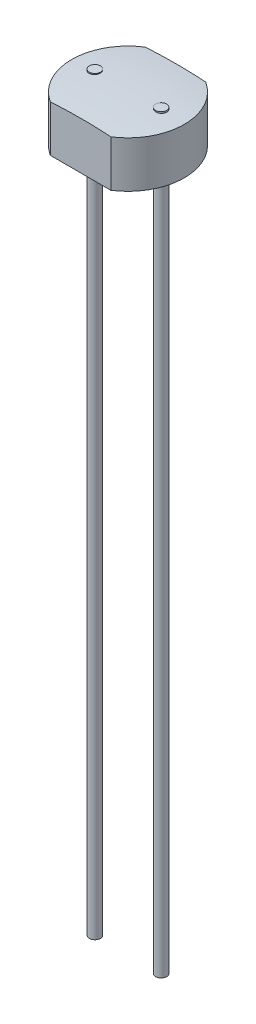
ISO-10303-21;
HEADER;
FILE_DESCRIPTION(('STEP AP214'),'2;1');
FILE_NAME('part.step','',(''),(''),'','','');
FILE_SCHEMA(('AUTOMOTIVE_DESIGN { 1 0 10303 214 1 1 1 1 }'));
ENDSEC;
DATA;
#1=APPLICATION_CONTEXT('core data for automotive mechanical design processes');
#2=APPLICATION_PROTOCOL_DEFINITION('international standard','automotive_design',2000,#1);
#3=PRODUCT_CONTEXT('',#1,'mechanical');
#4=PRODUCT('Part','Part','',(#3));
#5=PRODUCT_RELATED_PRODUCT_CATEGORY('part','',(#4));
#6=PRODUCT_DEFINITION_FORMATION('','',#4);
#7=PRODUCT_DEFINITION_CONTEXT('part definition',#1,'design');
#8=PRODUCT_DEFINITION('design','',#6,#7);
#9=PRODUCT_DEFINITION_SHAPE('','',#8);
#10=(LENGTH_UNIT() NAMED_UNIT(*) SI_UNIT(.MILLI.,.METRE.));
#11=(NAMED_UNIT(*) PLANE_ANGLE_UNIT() SI_UNIT($,.RADIAN.));
#12=(NAMED_UNIT(*) SI_UNIT($,.STERADIAN.) SOLID_ANGLE_UNIT());
#13=UNCERTAINTY_MEASURE_WITH_UNIT(LENGTH_MEASURE(1.E-05),#10,'distance_accuracy_value','');
#14=(GEOMETRIC_REPRESENTATION_CONTEXT(3) GLOBAL_UNCERTAINTY_ASSIGNED_CONTEXT((#13)) GLOBAL_UNIT_ASSIGNED_CONTEXT((#10,
#11,#12)) REPRESENTATION_CONTEXT('',''));
#15=CARTESIAN_POINT('',(0.,0.,0.));
#16=DIRECTION('',(0.,0.,1.));
#17=DIRECTION('',(1.,0.,0.));
#18=AXIS2_PLACEMENT_3D('',#15,#16,#17);
#19=CARTESIAN_POINT('',(0.,2.1,0.));
#20=DIRECTION('',(0.,-1.,0.));
#21=DIRECTION('',(0.,0.,-1.));
#22=AXIS2_PLACEMENT_3D('',#19,#20,#21);
#23=CYLINDRICAL_SURFACE('',#22,2.55);
#24=CARTESIAN_POINT('',(0.,0.,0.));
#25=DIRECTION('',(0.,1.,0.));
#26=DIRECTION('',(0.,0.,-1.));
#27=AXIS2_PLACEMENT_3D('',#24,#25,#26);
#28=CIRCLE('',#27,2.55);
#29=CARTESIAN_POINT('',(-1.37113092008021,0.,-2.15));
#30=VERTEX_POINT('',#29);
#31=CARTESIAN_POINT('',(-1.37113092008021,0.,2.15));
#32=VERTEX_POINT('',#31);
#33=EDGE_CURVE('E98',#30,#32,#28,.T.);
#34=ORIENTED_EDGE('',*,*,#33,.T.);
#35=DIRECTION('',(0.,-1.,0.));
#36=VECTOR('',#35,1.);
#37=CARTESIAN_POINT('',(-1.37113092008021,2.1,2.15));
#38=LINE('',#37,#36);
#39=CARTESIAN_POINT('',(-1.37113092008021,2.1,2.15));
#40=VERTEX_POINT('',#39);
#41=EDGE_CURVE('E116',#40,#32,#38,.T.);
#42=ORIENTED_EDGE('',*,*,#41,.F.);
#43=CARTESIAN_POINT('',(0.,2.1,0.));
#44=DIRECTION('',(0.,1.,0.));
#45=DIRECTION('',(0.,0.,-1.));
#46=AXIS2_PLACEMENT_3D('',#43,#44,#45);
#47=CIRCLE('',#46,2.55);
#48=CARTESIAN_POINT('',(-1.37113092008021,2.1,-2.15));
#49=VERTEX_POINT('',#48);
#50=EDGE_CURVE('E93',#49,#40,#47,.T.);
#51=ORIENTED_EDGE('',*,*,#50,.F.);
#52=DIRECTION('',(0.,-1.,0.));
#53=VECTOR('',#52,1.);
#54=CARTESIAN_POINT('',(-1.37113092008021,2.1,-2.15));
#55=LINE('',#54,#53);
#56=EDGE_CURVE('E88',#49,#30,#55,.T.);
#57=ORIENTED_EDGE('',*,*,#56,.T.);
#58=EDGE_LOOP('',(#34,#42,#51,#57));
#59=FACE_BOUND('',#58,.T.);
#60=ADVANCED_FACE('F39',(#59),#23,.T.);
#61=CARTESIAN_POINT('',(-1.37113092008021,2.1,2.15));
#62=DIRECTION('',(0.,0.,-1.));
#63=DIRECTION('',(-1.,0.,0.));
#64=AXIS2_PLACEMENT_3D('',#61,#62,#63);
#65=PLANE('',#64);
#66=DIRECTION('',(1.,0.,0.));
#67=VECTOR('',#66,1.);
#68=CARTESIAN_POINT('',(-1.37113092008021,0.,2.15));
#69=LINE('',#68,#67);
#70=CARTESIAN_POINT('',(1.37113092008021,0.,2.15));
#71=VERTEX_POINT('',#70);
#72=EDGE_CURVE('E102',#32,#71,#69,.T.);
#73=ORIENTED_EDGE('',*,*,#72,.T.);
#74=DIRECTION('',(0.,-1.,0.));
#75=VECTOR('',#74,1.);
#76=CARTESIAN_POINT('',(1.37113092008021,2.1,2.15));
#77=LINE('',#76,#75);
#78=CARTESIAN_POINT('',(1.37113092008021,2.1,2.15));
#79=VERTEX_POINT('',#78);
#80=EDGE_CURVE('E114',#79,#71,#77,.T.);
#81=ORIENTED_EDGE('',*,*,#80,.F.);
#82=CARTESIAN_POINT('',(0.,-19.5,2.15));
#83=DIRECTION('',(0.,0.,-1.));
#84=DIRECTION('',(-1.,0.,0.));
#85=AXIS2_PLACEMENT_3D('',#82,#83,#84);
#86=CIRCLE('',#85,21.6434747672364);
#87=EDGE_CURVE('E118',#40,#79,#86,.T.);
#88=ORIENTED_EDGE('',*,*,#87,.F.);
#89=ORIENTED_EDGE('',*,*,#41,.T.);
#90=EDGE_LOOP('',(#73,#81,#88,#89));
#91=FACE_BOUND('',#90,.T.);
#92=ADVANCED_FACE('F159',(#91),#65,.F.);
#93=CARTESIAN_POINT('',(0.,2.1,0.));
#94=DIRECTION('',(0.,-1.,0.));
#95=DIRECTION('',(0.,0.,-1.));
#96=AXIS2_PLACEMENT_3D('',#93,#94,#95);
#97=CYLINDRICAL_SURFACE('',#96,2.55);
#98=CARTESIAN_POINT('',(0.,0.,0.));
#99=DIRECTION('',(0.,1.,0.));
#100=DIRECTION('',(0.,0.,-1.));
#101=AXIS2_PLACEMENT_3D('',#98,#99,#100);
#102=CIRCLE('',#101,2.55);
#103=CARTESIAN_POINT('',(1.37113092008021,0.,-2.15));
#104=VERTEX_POINT('',#103);
#105=EDGE_CURVE('E80',#71,#104,#102,.T.);
#106=ORIENTED_EDGE('',*,*,#105,.T.);
#107=DIRECTION('',(0.,-1.,0.));
#108=VECTOR('',#107,1.);
#109=CARTESIAN_POINT('',(1.37113092008021,2.1,-2.15));
#110=LINE('',#109,#108);
#111=CARTESIAN_POINT('',(1.37113092008021,2.1,-2.15));
#112=VERTEX_POINT('',#111);
#113=EDGE_CURVE('E90',#112,#104,#110,.T.);
#114=ORIENTED_EDGE('',*,*,#113,.F.);
#115=CARTESIAN_POINT('',(0.,2.1,0.));
#116=DIRECTION('',(0.,1.,0.));
#117=DIRECTION('',(0.,0.,-1.));
#118=AXIS2_PLACEMENT_3D('',#115,#116,#117);
#119=CIRCLE('',#118,2.55);
#120=EDGE_CURVE('E99',#79,#112,#119,.T.);
#121=ORIENTED_EDGE('',*,*,#120,.F.);
#122=ORIENTED_EDGE('',*,*,#80,.T.);
#123=EDGE_LOOP('',(#106,#114,#121,#122));
#124=FACE_BOUND('',#123,.T.);
#125=ADVANCED_FACE('F163',(#124),#97,.T.);
#126=CARTESIAN_POINT('',(-1.37113092008021,2.1,-2.15));
#127=DIRECTION('',(0.,0.,1.));
#128=DIRECTION('',(1.,0.,0.));
#129=AXIS2_PLACEMENT_3D('',#126,#127,#128);
#130=PLANE('',#129);
#131=DIRECTION('',(-1.,0.,0.));
#132=VECTOR('',#131,1.);
#133=CARTESIAN_POINT('',(-1.37113092008021,0.,-2.15));
#134=LINE('',#133,#132);
#135=EDGE_CURVE('E85',#104,#30,#134,.T.);
#136=ORIENTED_EDGE('',*,*,#135,.T.);
#137=ORIENTED_EDGE('',*,*,#56,.F.);
#138=CARTESIAN_POINT('',(0.,-19.5,-2.15));
#139=DIRECTION('',(0.,0.,1.));
#140=DIRECTION('',(1.,0.,0.));
#141=AXIS2_PLACEMENT_3D('',#138,#139,#140);
#142=CIRCLE('',#141,21.6434747672364);
#143=EDGE_CURVE('E62',#112,#49,#142,.T.);
#144=ORIENTED_EDGE('',*,*,#143,.F.);
#145=ORIENTED_EDGE('',*,*,#113,.T.);
#146=EDGE_LOOP('',(#136,#137,#144,#145));
#147=FACE_BOUND('',#146,.T.);
#148=ADVANCED_FACE('F87',(#147),#130,.F.);
#149=CARTESIAN_POINT('',(0.,0.,0.));
#150=DIRECTION('',(0.,-1.,0.));
#151=DIRECTION('',(0.,0.,-1.));
#152=AXIS2_PLACEMENT_3D('',#149,#150,#151);
#153=PLANE('',#152);
#154=CARTESIAN_POINT('',(1.5,0.,0.));
#155=DIRECTION('',(0.,-1.,0.));
#156=DIRECTION('',(0.,0.,-1.));
#157=AXIS2_PLACEMENT_3D('',#154,#155,#156);
#158=CIRCLE('',#157,0.25);
#159=CARTESIAN_POINT('',(1.5,0.,-0.25));
#160=VERTEX_POINT('',#159);
#161=EDGE_CURVE('E11',#160,#160,#158,.T.);
#162=ORIENTED_EDGE('',*,*,#161,.F.);
#163=EDGE_LOOP('',(#162));
#164=FACE_BOUND('',#163,.T.);
#165=CARTESIAN_POINT('',(-1.5,0.,0.));
#166=DIRECTION('',(0.,-1.,0.));
#167=DIRECTION('',(0.,0.,-1.));
#168=AXIS2_PLACEMENT_3D('',#165,#166,#167);
#169=CIRCLE('',#168,0.25);
#170=CARTESIAN_POINT('',(-1.5,0.,-0.25));
#171=VERTEX_POINT('',#170);
#172=EDGE_CURVE('E53',#171,#171,#169,.T.);
#173=ORIENTED_EDGE('',*,*,#172,.F.);
#174=EDGE_LOOP('',(#173));
#175=FACE_BOUND('',#174,.T.);
#176=ORIENTED_EDGE('',*,*,#33,.F.);
#177=ORIENTED_EDGE('',*,*,#135,.F.);
#178=ORIENTED_EDGE('',*,*,#105,.F.);
#179=ORIENTED_EDGE('',*,*,#72,.F.);
#180=EDGE_LOOP('',(#176,#177,#178,#179));
#181=FACE_BOUND('',#180,.T.);
#182=ADVANCED_FACE('F101',(#164,#175,#181),#153,.T.);
#183=CARTESIAN_POINT('',(0.,-19.5,0.));
#184=DIRECTION('',(0.,-1.,0.));
#185=DIRECTION('',(-1.,0.,0.));
#186=AXIS2_PLACEMENT_3D('',#183,#184,#185);
#187=SPHERICAL_SURFACE('',#186,21.75);
#188=CARTESIAN_POINT('',(1.32439932078148,2.20891061351305,-0.177945003648347));
#189=CARTESIAN_POINT('',(1.33441201934879,2.20821876356183,-0.187824921836381));
#190=CARTESIAN_POINT('',(1.34526593120875,2.20746881060951,-0.196863100050032));
#191=CARTESIAN_POINT('',(1.36834334746013,2.20587411908933,-0.212990966125288));
#192=CARTESIAN_POINT('',(1.38056852442441,2.2050292647656,-0.220078237219959));
#193=CARTESIAN_POINT('',(1.4060262095274,2.20326984492649,-0.232092297628657));
#194=CARTESIAN_POINT('',(1.4192581467842,2.20235531891796,-0.237020300793374));
#195=CARTESIAN_POINT('',(1.44635520787607,2.20048237485551,-0.244581432539478));
#196=CARTESIAN_POINT('',(1.46022017255553,2.19952396783398,-0.247215134646043));
#197=CARTESIAN_POINT('',(1.48821420749836,2.19758876699713,-0.250118744351127));
#198=CARTESIAN_POINT('',(1.50234362318547,2.19661194912004,-0.250385307441313));
#199=CARTESIAN_POINT('',(1.53044738097243,2.19466890286094,-0.248538283950321));
#200=CARTESIAN_POINT('',(1.54442171599848,2.19370267496201,-0.246424589243831));
#201=CARTESIAN_POINT('',(1.5718253728353,2.19180778033858,-0.239874304840503));
#202=CARTESIAN_POINT('',(1.58525440923069,2.19087913328515,-0.235436515152048));
#203=CARTESIAN_POINT('',(1.611177506873,2.18908638656788,-0.224361812743845));
#204=CARTESIAN_POINT('',(1.62367157305522,2.18822228656332,-0.217724911633204));
#205=CARTESIAN_POINT('',(1.64735612689692,2.18658415450666,-0.202446465373501));
#206=CARTESIAN_POINT('',(1.65854789950754,2.18581003367446,-0.19380692182616));
#207=CARTESIAN_POINT('',(1.67932175048545,2.18437306601234,-0.174763423716953));
#208=CARTESIAN_POINT('',(1.68890384861251,2.18371021781648,-0.164359490817246));
#209=CARTESIAN_POINT('',(1.70616465597526,2.18251614524709,-0.142105641858409));
#210=CARTESIAN_POINT('',(1.71384731088814,2.18198464802167,-0.130258800903866));
#211=CARTESIAN_POINT('',(1.72711412976465,2.18106680544956,-0.105438054946156));
#212=CARTESIAN_POINT('',(1.73269831872961,2.18068045837353,-0.09246416337304));
#213=CARTESIAN_POINT('',(1.74159677730039,2.18006480071786,-0.0657893133319071));
#214=CARTESIAN_POINT('',(1.74491617554746,2.17983513533109,-0.0520900738044222));
#215=CARTESIAN_POINT('',(1.74920971945151,2.17953806851401,-0.0243272010197875));
#216=CARTESIAN_POINT('',(1.7501838890484,2.17947066542734,-0.010263571483783));
#217=CARTESIAN_POINT('',(1.74975920195918,2.17950004945419,0.0178071885066658));
#218=CARTESIAN_POINT('',(1.74836377687499,2.17959659913443,0.0318143712678779));
#219=CARTESIAN_POINT('',(1.74324668751133,2.17995064497308,0.0593950104089598));
#220=CARTESIAN_POINT('',(1.7395250283242,2.18020814077917,0.0729684677382248));
#221=CARTESIAN_POINT('',(1.72986242509835,2.18087666206524,0.0992970789318936));
#222=CARTESIAN_POINT('',(1.72392145362719,2.18128768944301,0.112052222679015));
#223=CARTESIAN_POINT('',(1.70999052975222,2.18225146616588,0.136383665790807));
#224=CARTESIAN_POINT('',(1.70200056501336,2.18280421636415,0.147959958058141));
#225=CARTESIAN_POINT('',(1.68418665576786,2.18403653409068,0.169623780384949));
#226=CARTESIAN_POINT('',(1.67436004476433,2.18471628600319,0.179709107199105));
#227=CARTESIAN_POINT('',(1.65316052731188,2.18618267364297,0.198087497956402));
#228=CARTESIAN_POINT('',(1.64178760261375,2.18696931063166,0.206380540744461));
#229=CARTESIAN_POINT('',(1.61779068352983,2.18862901703567,0.220959036600619));
#230=CARTESIAN_POINT('',(1.60516390563672,2.18950227874991,0.227239885984948));
#231=CARTESIAN_POINT('',(1.57903913854843,2.19130893698438,0.2375925983716));
#232=CARTESIAN_POINT('',(1.56554113870634,2.19224233423949,0.241664434372619));
#233=CARTESIAN_POINT('',(1.53802683307099,2.19414484157105,0.247491651214878));
#234=CARTESIAN_POINT('',(1.52400950425979,2.1951140221219,0.249242179349194));
#235=CARTESIAN_POINT('',(1.49588043624243,2.19705877847979,0.250362054286667));
#236=CARTESIAN_POINT('',(1.48176869628343,2.19803435433783,0.249731382079346));
#237=CARTESIAN_POINT('',(1.4538367125268,2.19996522567899,0.24610461582182));
#238=CARTESIAN_POINT('',(1.44001677135817,2.20092050011331,0.243106179016955));
#239=CARTESIAN_POINT('',(1.41307564815082,2.20278263087816,0.234824948651333));
#240=CARTESIAN_POINT('',(1.39995446496191,2.2036894872884,0.229542158850898));
#241=CARTESIAN_POINT('',(1.37479156554712,2.20542849288882,0.216844052055891));
#242=CARTESIAN_POINT('',(1.36274926814503,2.20626068230112,0.209429892361944));
#243=CARTESIAN_POINT('',(1.34008030739658,2.20782715272157,0.192676733829782));
#244=CARTESIAN_POINT('',(1.32945363449442,2.20856143439062,0.183337747985675));
#245=CARTESIAN_POINT('',(1.30993895339209,2.20990980162456,0.16301798676548));
#246=CARTESIAN_POINT('',(1.30104778396092,2.21052410573058,0.152040261992482));
#247=CARTESIAN_POINT('',(1.28523534646112,2.21161657408554,0.128741418013117));
#248=CARTESIAN_POINT('',(1.27831405717588,2.21209473980077,0.116420313277604));
#249=CARTESIAN_POINT('',(1.26665460218191,2.21290022904004,0.0908150120630983));
#250=CARTESIAN_POINT('',(1.26191143887195,2.21322789787197,0.0775331020512055));
#251=CARTESIAN_POINT('',(1.25472169260389,2.21372457650284,0.0503593152942974));
#252=CARTESIAN_POINT('',(1.25227499306226,2.21389359435594,0.0364674695510936));
#253=CARTESIAN_POINT('',(1.24975081297093,2.21406796457283,0.00849587995669463));
#254=CARTESIAN_POINT('',(1.24966885059987,2.21407362654054,-0.00558345784605762));
#255=CARTESIAN_POINT('',(1.25186568792787,2.21392186909421,-0.0335596605068923));
#256=CARTESIAN_POINT('',(1.25414506486818,2.21376440980436,-0.0474564799062648));
#257=CARTESIAN_POINT('',(1.26099865054793,2.21329095557246,-0.074667978334252));
#258=CARTESIAN_POINT('',(1.26557287216246,2.21297495974096,-0.0879826540963314));
#259=CARTESIAN_POINT('',(1.2768821765095,2.21219366065776,-0.113642290549126));
#260=CARTESIAN_POINT('',(1.28361465427097,2.21172853739971,-0.125988398035096));
#261=CARTESIAN_POINT('',(1.29611795290235,2.21086470870509,-0.14494169321361));
#262=CARTESIAN_POINT('',(1.30128966993755,2.21050740069094,-0.151953567985997));
#263=CARTESIAN_POINT('',(1.3123333950267,2.20974434443952,-0.165399333485496));
#264=CARTESIAN_POINT('',(1.3182054028022,2.20933859622151,-0.17183322444244));
#265=CARTESIAN_POINT('',(1.32439932078148,2.20891061351305,-0.177945003648347));
#266=B_SPLINE_CURVE_WITH_KNOTS('',3,(#188,#189,#190,#191,#192,#193,#194,#195,#196,#197,#198,
#199,#200,#201,#202,#203,#204,#205,#206,#207,#208,#209,#210,#211,#212,#213,#214,#215,#216,#217,
#218,#219,#220,#221,#222,#223,#224,#225,#226,#227,#228,#229,#230,#231,#232,#233,#234,#235,#236,
#237,#238,#239,#240,#241,#242,#243,#244,#245,#246,#247,#248,#249,#250,#251,#252,#253,#254,#255,
#256,#257,#258,#259,#260,#261,#262,#263,#264,#265),.UNSPECIFIED.,.T.,.F.,(4,2,2,2,2,2,2,2,2,2,2,
2,2,2,2,2,2,2,2,2,2,2,2,2,2,2,2,2,2,2,2,2,2,2,2,2,2,2,4),(0.,0.0422186832758446,
0.084489433706692,0.126736390695228,0.168972783833827,0.211268842894667,0.253566823368846,
0.29588666497062,0.338206283169526,0.380483784745249,0.422760767299678,0.464949176545982,
0.50713708313985,0.549229134863601,0.59132075691322,0.633351474648156,0.675382100374438,
0.717413245649475,0.759444643960294,0.801537545487971,0.843630943828734,0.885819970783825,
0.92800951341396,0.970287115199299,1.01256505451152,1.05488487768828,1.09720463120173,
1.13950144901208,1.18179798129462,1.22401673609787,1.26623503616673,1.30835597841868,
1.35047478222034,1.3925137541566,1.43456300515623,1.47661249207314,1.51861141600736,
1.54472816801282,1.57084490963307),.UNSPECIFIED.);
#267=CARTESIAN_POINT('',(1.32439932078148,2.20891061351305,-0.177945003648347));
#268=VERTEX_POINT('',#267);
#269=EDGE_CURVE('E42',#268,#268,#266,.T.);
#270=ORIENTED_EDGE('',*,*,#269,.T.);
#271=EDGE_LOOP('',(#270));
#272=FACE_BOUND('',#271,.T.);
#273=CARTESIAN_POINT('',(-1.6771057936314,2.18452634066757,-0.176446983148459));
#274=CARTESIAN_POINT('',(-1.66717762294779,2.18521310942897,-0.186411330445864));
#275=CARTESIAN_POINT('',(-1.65640120448394,2.18595852196197,-0.195541190125914));
#276=CARTESIAN_POINT('',(-1.63346233038843,2.18754512707176,-0.211864175566404));
#277=CARTESIAN_POINT('',(-1.6212981819486,2.18838643662644,-0.219054899154686));
#278=CARTESIAN_POINT('',(-1.59594435080197,2.19013987309849,-0.231284619574214));
#279=CARTESIAN_POINT('',(-1.58275525001654,2.19105195983139,-0.236324826971508));
#280=CARTESIAN_POINT('',(-1.55572446701321,2.19292113736029,-0.244115978920297));
#281=CARTESIAN_POINT('',(-1.54188294867838,2.19387821685425,-0.2468674951721));
#282=CARTESIAN_POINT('',(-1.51391555176088,2.19581190646151,-0.250009277998273));
#283=CARTESIAN_POINT('',(-1.49978929495722,2.19678854253894,-0.250396163420302));
#284=CARTESIAN_POINT('',(-1.47167164222412,2.19873235970798,-0.248788694016554));
#285=CARTESIAN_POINT('',(-1.45768025246248,2.1996995403672,-0.24679423080177));
#286=CARTESIAN_POINT('',(-1.43022226007088,2.20159750159689,-0.240477924528416));
#287=CARTESIAN_POINT('',(-1.41675594956946,2.20252826190585,-0.236154805185875));
#288=CARTESIAN_POINT('',(-1.39073955975922,2.20432634591258,-0.225301607784407));
#289=CARTESIAN_POINT('',(-1.37818947579615,2.20519366993259,-0.218771540937304));
#290=CARTESIAN_POINT('',(-1.35437538763773,2.20683934879846,-0.20369555590599));
#291=CARTESIAN_POINT('',(-1.34311015416573,2.20761778868475,-0.195151588933116));
#292=CARTESIAN_POINT('',(-1.32217434831384,2.20906440820172,-0.176285533228639));
#293=CARTESIAN_POINT('',(-1.31250375655928,2.20973258917203,-0.165963466103819));
#294=CARTESIAN_POINT('',(-1.29505346810155,2.21093825608359,-0.143856915621345));
#295=CARTESIAN_POINT('',(-1.2872698861283,2.21147601056825,-0.132075513904964));
#296=CARTESIAN_POINT('',(-1.27379167808947,2.21240717155866,-0.107367693543521));
#297=CARTESIAN_POINT('',(-1.26809702720282,2.21280057977957,-0.0944412885058663));
#298=CARTESIAN_POINT('',(-1.2589715534948,2.21343099188471,-0.0678420243948986));
#299=CARTESIAN_POINT('',(-1.25553561157577,2.21366834943951,-0.0541709298174145));
#300=CARTESIAN_POINT('',(-1.25100599651072,2.21398125713942,-0.0264443010650625));
#301=CARTESIAN_POINT('',(-1.24991229921158,2.21405680895306,-0.0123887708559896));
#302=CARTESIAN_POINT('',(-1.25009857018569,2.21404394140922,0.0156856932503847));
#303=CARTESIAN_POINT('',(-1.25137504731142,2.2139557632178,0.0297046505632045));
#304=CARTESIAN_POINT('',(-1.25625801461523,2.21361844521284,0.0573286665761431));
#305=CARTESIAN_POINT('',(-1.25986449920568,2.21336930578532,0.0709337262687569));
#306=CARTESIAN_POINT('',(-1.26930363609838,2.21271722279995,0.0973438871770336));
#307=CARTESIAN_POINT('',(-1.2751362279365,2.21231428341952,0.110149010109088));
#308=CARTESIAN_POINT('',(-1.28886037200404,2.21136612716588,0.134597869619008));
#309=CARTESIAN_POINT('',(-1.29675193616505,2.21082090946817,0.146241599466146));
#310=CARTESIAN_POINT('',(-1.31438132877767,2.20960286103805,0.168055493685227));
#311=CARTESIAN_POINT('',(-1.32412177462882,2.20892984939155,0.178223532518717));
#312=CARTESIAN_POINT('',(-1.34516402079998,2.20747586581847,0.196780620651609));
#313=CARTESIAN_POINT('',(-1.35646583934596,2.20669489263166,0.205169649181648));
#314=CARTESIAN_POINT('',(-1.38033724802969,2.20504524152726,0.219950788076292));
#315=CARTESIAN_POINT('',(-1.39290964143907,2.20417636967418,0.226338349526774));
#316=CARTESIAN_POINT('',(-1.4189442158956,2.20237701637896,0.236912153981121));
#317=CARTESIAN_POINT('',(-1.432406407855,2.20144653418126,0.241098369982618));
#318=CARTESIAN_POINT('',(-1.45986884478558,2.19954825262239,0.247159123216375));
#319=CARTESIAN_POINT('',(-1.47387016196502,2.19858037888307,0.249028779406001));
#320=CARTESIAN_POINT('',(-1.50198734878535,2.19663658031403,0.250388020684758));
#321=CARTESIAN_POINT('',(-1.51610321936324,2.19566065541847,0.249877586286101));
#322=CARTESIAN_POINT('',(-1.54406412768455,2.19372740108349,0.246489103324045));
#323=CARTESIAN_POINT('',(-1.55790887095459,2.19277009186985,0.243608612398504));
#324=CARTESIAN_POINT('',(-1.58491903723392,2.19090232703865,0.235557526474536));
#325=CARTESIAN_POINT('',(-1.59808446118183,2.18999187135634,0.230386934640412));
#326=CARTESIAN_POINT('',(-1.62335464270215,2.18824420823425,0.217903956769253));
#327=CARTESIAN_POINT('',(-1.63545992380643,2.18740696464034,0.210592635728289));
#328=CARTESIAN_POINT('',(-1.65827125088607,2.18582917185469,0.194033113593017));
#329=CARTESIAN_POINT('',(-1.66897730605119,2.1850886220279,0.184784925220617));
#330=CARTESIAN_POINT('',(-1.68866502615045,2.18372674116581,0.16463167837015));
#331=CARTESIAN_POINT('',(-1.69764978166757,2.18310519645876,0.153729653648495));
#332=CARTESIAN_POINT('',(-1.71366076313591,2.18199755600169,0.130565326492944));
#333=CARTESIAN_POINT('',(-1.72068701014451,2.18151145879536,0.118303038686223));
#334=CARTESIAN_POINT('',(-1.73256445065776,2.18068972190098,0.0927967346944285));
#335=CARTESIAN_POINT('',(-1.73742063397309,2.18035373704724,0.0795550531546403));
#336=CARTESIAN_POINT('',(-1.74484149308645,2.17984030354841,0.0524420710766897));
#337=CARTESIAN_POINT('',(-1.74740628561303,2.17966284682753,0.038570802648919));
#338=CARTESIAN_POINT('',(-1.75016803934949,2.17947176227443,0.0106205768508041));
#339=CARTESIAN_POINT('',(-1.75036955460209,2.17945781935061,-0.00345792871066771));
#340=CARTESIAN_POINT('',(-1.74841021165365,2.17959338570354,-0.031452596477782));
#341=CARTESIAN_POINT('',(-1.74624877613823,2.17974293492457,-0.0453687181702017));
#342=CARTESIAN_POINT('',(-1.73962617149084,2.18020114154104,-0.0726377869903975));
#343=CARTESIAN_POINT('',(-1.73516508338815,2.18050979333043,-0.0859907539432471));
#344=CARTESIAN_POINT('',(-1.72407387463162,2.18127714233239,-0.111745383948285));
#345=CARTESIAN_POINT('',(-1.7174463694757,2.18173565861468,-0.124148171966185));
#346=CARTESIAN_POINT('',(-1.70510454916736,2.18258947770877,-0.14320649869999));
#347=CARTESIAN_POINT('',(-1.69999279264145,2.1829431066152,-0.150261646535823));
#348=CARTESIAN_POINT('',(-1.68906415031105,2.18369912382009,-0.163799963885544));
#349=CARTESIAN_POINT('',(-1.68324726470967,2.18410151210449,-0.170283133564186));
#350=CARTESIAN_POINT('',(-1.6771057936314,2.18452634066757,-0.176446983148459));
#351=B_SPLINE_CURVE_WITH_KNOTS('',3,(#273,#274,#275,#276,#277,#278,#279,#280,#281,#282,#283,
#284,#285,#286,#287,#288,#289,#290,#291,#292,#293,#294,#295,#296,#297,#298,#299,#300,#301,#302,
#303,#304,#305,#306,#307,#308,#309,#310,#311,#312,#313,#314,#315,#316,#317,#318,#319,#320,#321,
#322,#323,#324,#325,#326,#327,#328,#329,#330,#331,#332,#333,#334,#335,#336,#337,#338,#339,#340,
#341,#342,#343,#344,#345,#346,#347,#348,#349,#350),.UNSPECIFIED.,.T.,.F.,(4,2,2,2,2,2,2,2,2,2,2,
2,2,2,2,2,2,2,2,2,2,2,2,2,2,2,2,2,2,2,2,2,2,2,2,2,2,2,4),(0.,0.0422168554994122,
0.084485770828844,0.126730860697268,0.168965394842622,0.211260305452366,0.253557141222528,
0.295877182558382,0.338197008901485,0.380476000078847,0.42275447753452,0.464945151746129,
0.5071353246241,0.549229545735548,0.591323332771363,0.633355166958265,0.675386900348074,
0.717417492179399,0.759448327580356,0.801539114485406,0.843630392759552,0.885816653170002,
0.928003431037804,0.970278947045874,1.01255480919949,1.05487429161017,1.0971937155469,
1.1394921215694,1.18179024977235,1.22401170517115,1.26623270659842,1.30835611977805,
1.35047738697476,1.39251747299019,1.43456783250416,1.47661671045639,1.51861500947976,
1.54472995854835,1.57084490009471),.UNSPECIFIED.);
#352=CARTESIAN_POINT('',(-1.6771057936314,2.18452634066757,-0.176446983148459));
#353=VERTEX_POINT('',#352);
#354=EDGE_CURVE('E104',#353,#353,#351,.T.);
#355=ORIENTED_EDGE('',*,*,#354,.T.);
#356=EDGE_LOOP('',(#355));
#357=FACE_BOUND('',#356,.T.);
#358=ORIENTED_EDGE('',*,*,#120,.T.);
#359=ORIENTED_EDGE('',*,*,#143,.T.);
#360=ORIENTED_EDGE('',*,*,#50,.T.);
#361=ORIENTED_EDGE('',*,*,#87,.T.);
#362=EDGE_LOOP('',(#358,#359,#360,#361));
#363=FACE_BOUND('',#362,.T.);
#364=ADVANCED_FACE('F124',(#272,#357,#363),#187,.T.);
#365=CARTESIAN_POINT('',(-1.5,2.25,0.));
#366=DIRECTION('',(0.,1.,0.));
#367=DIRECTION('',(0.,0.,1.));
#368=AXIS2_PLACEMENT_3D('',#365,#366,#367);
#369=PLANE('',#368);
#370=CARTESIAN_POINT('',(-1.5,2.25,0.));
#371=DIRECTION('',(0.,1.,0.));
#372=DIRECTION('',(0.,0.,1.));
#373=AXIS2_PLACEMENT_3D('',#370,#371,#372);
#374=CIRCLE('',#373,0.25);
#375=CARTESIAN_POINT('',(-1.5,2.25,0.25));
#376=VERTEX_POINT('',#375);
#377=EDGE_CURVE('E183',#376,#376,#374,.T.);
#378=ORIENTED_EDGE('',*,*,#377,.T.);
#379=EDGE_LOOP('',(#378));
#380=FACE_BOUND('',#379,.T.);
#381=ADVANCED_FACE('F134',(#380),#369,.T.);
#382=CARTESIAN_POINT('',(-1.5,-31.75,0.));
#383=DIRECTION('',(0.,1.,0.));
#384=DIRECTION('',(0.,0.,1.));
#385=AXIS2_PLACEMENT_3D('',#382,#383,#384);
#386=CYLINDRICAL_SURFACE('',#385,0.25);
#387=ORIENTED_EDGE('',*,*,#377,.F.);
#388=EDGE_LOOP('',(#387));
#389=FACE_BOUND('',#388,.T.);
#390=ORIENTED_EDGE('',*,*,#354,.F.);
#391=EDGE_LOOP('',(#390));
#392=FACE_BOUND('',#391,.T.);
#393=ADVANCED_FACE('F132',(#389,#392),#386,.T.);
#394=ORIENTED_EDGE('',*,*,#172,.T.);
#395=EDGE_LOOP('',(#394));
#396=FACE_BOUND('',#395,.T.);
#397=CARTESIAN_POINT('',(-1.5,-31.75,0.));
#398=DIRECTION('',(0.,1.,0.));
#399=DIRECTION('',(0.,0.,1.));
#400=AXIS2_PLACEMENT_3D('',#397,#398,#399);
#401=CIRCLE('',#400,0.25);
#402=CARTESIAN_POINT('',(-1.5,-31.75,0.25));
#403=VERTEX_POINT('',#402);
#404=EDGE_CURVE('E108',#403,#403,#401,.T.);
#405=ORIENTED_EDGE('',*,*,#404,.T.);
#406=EDGE_LOOP('',(#405));
#407=FACE_BOUND('',#406,.T.);
#408=ADVANCED_FACE('F127',(#396,#407),#386,.T.);
#409=CARTESIAN_POINT('',(-1.5,-31.75,0.));
#410=DIRECTION('',(0.,1.,0.));
#411=DIRECTION('',(0.,0.,1.));
#412=AXIS2_PLACEMENT_3D('',#409,#410,#411);
#413=PLANE('',#412);
#414=ORIENTED_EDGE('',*,*,#404,.F.);
#415=EDGE_LOOP('',(#414));
#416=FACE_BOUND('',#415,.T.);
#417=ADVANCED_FACE('F131',(#416),#413,.F.);
#418=CARTESIAN_POINT('',(1.5,2.25,0.));
#419=DIRECTION('',(0.,1.,0.));
#420=DIRECTION('',(0.,0.,1.));
#421=AXIS2_PLACEMENT_3D('',#418,#419,#420);
#422=PLANE('',#421);
#423=CARTESIAN_POINT('',(1.5,2.25,0.));
#424=DIRECTION('',(0.,1.,0.));
#425=DIRECTION('',(0.,0.,1.));
#426=AXIS2_PLACEMENT_3D('',#423,#424,#425);
#427=CIRCLE('',#426,0.25);
#428=CARTESIAN_POINT('',(1.5,2.25,0.25));
#429=VERTEX_POINT('',#428);
#430=EDGE_CURVE('E196',#429,#429,#427,.T.);
#431=ORIENTED_EDGE('',*,*,#430,.T.);
#432=EDGE_LOOP('',(#431));
#433=FACE_BOUND('',#432,.T.);
#434=ADVANCED_FACE('F140',(#433),#422,.T.);
#435=CARTESIAN_POINT('',(1.5,-31.75,0.));
#436=DIRECTION('',(0.,1.,0.));
#437=DIRECTION('',(0.,0.,1.));
#438=AXIS2_PLACEMENT_3D('',#435,#436,#437);
#439=CYLINDRICAL_SURFACE('',#438,0.25);
#440=ORIENTED_EDGE('',*,*,#430,.F.);
#441=EDGE_LOOP('',(#440));
#442=FACE_BOUND('',#441,.T.);
#443=ORIENTED_EDGE('',*,*,#269,.F.);
#444=EDGE_LOOP('',(#443));
#445=FACE_BOUND('',#444,.T.);
#446=ADVANCED_FACE('F148',(#442,#445),#439,.T.);
#447=ORIENTED_EDGE('',*,*,#161,.T.);
#448=EDGE_LOOP('',(#447));
#449=FACE_BOUND('',#448,.T.);
#450=CARTESIAN_POINT('',(1.5,-31.75,0.));
#451=DIRECTION('',(0.,1.,0.));
#452=DIRECTION('',(0.,0.,1.));
#453=AXIS2_PLACEMENT_3D('',#450,#451,#452);
#454=CIRCLE('',#453,0.25);
#455=CARTESIAN_POINT('',(1.5,-31.75,0.25));
#456=VERTEX_POINT('',#455);
#457=EDGE_CURVE('E193',#456,#456,#454,.T.);
#458=ORIENTED_EDGE('',*,*,#457,.T.);
#459=EDGE_LOOP('',(#458));
#460=FACE_BOUND('',#459,.T.);
#461=ADVANCED_FACE('F145',(#449,#460),#439,.T.);
#462=CARTESIAN_POINT('',(1.5,-31.75,0.));
#463=DIRECTION('',(0.,1.,0.));
#464=DIRECTION('',(0.,0.,1.));
#465=AXIS2_PLACEMENT_3D('',#462,#463,#464);
#466=PLANE('',#465);
#467=ORIENTED_EDGE('',*,*,#457,.F.);
#468=EDGE_LOOP('',(#467));
#469=FACE_BOUND('',#468,.T.);
#470=ADVANCED_FACE('F142',(#469),#466,.F.);
#471=CLOSED_SHELL('',(#60,#92,#125,#148,#182,#364,#381,#393,#408,#417,#434,#446,#461,#470));
#472=MANIFOLD_SOLID_BREP('B2',#471);
#473=ADVANCED_BREP_SHAPE_REPRESENTATION('',(#18,#472),#14);
#474=SHAPE_DEFINITION_REPRESENTATION(#9,#473);
ENDSEC;
END-ISO-10303-21;
